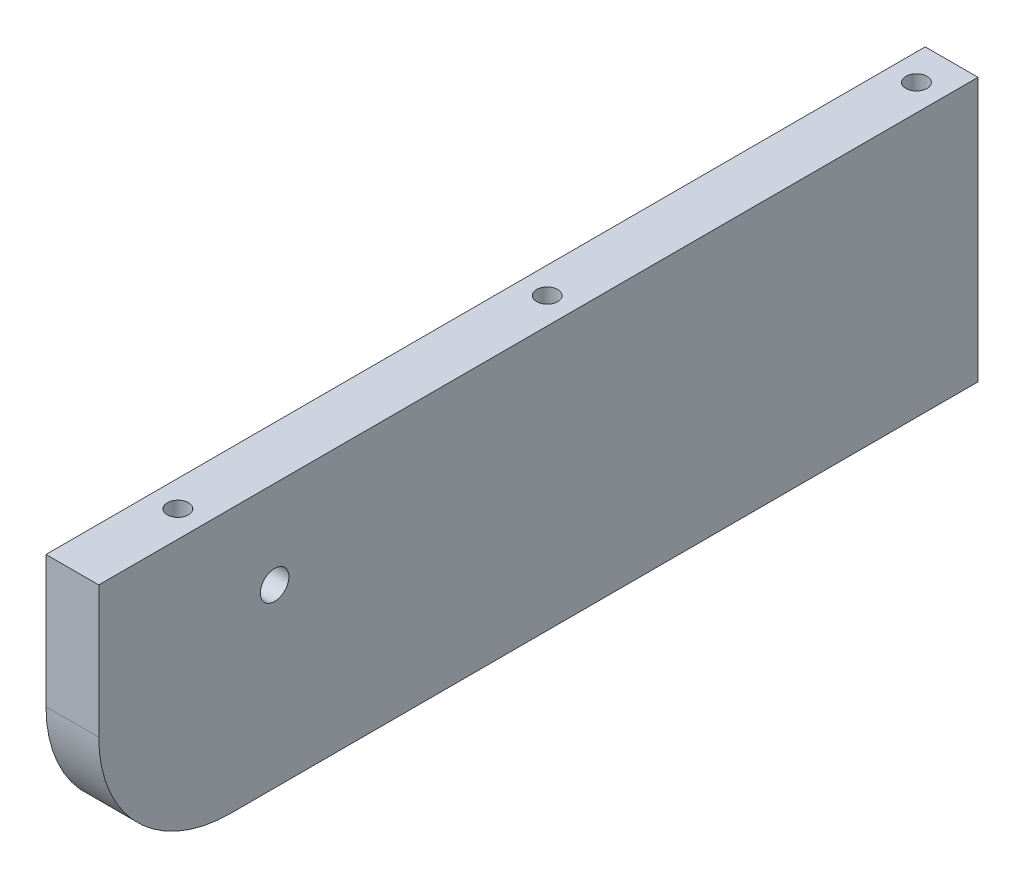
ISO-10303-21;
HEADER;
FILE_DESCRIPTION(('STEP AP214'),'2;1');
FILE_NAME('part.step','',(''),(''),'','','');
FILE_SCHEMA(('AUTOMOTIVE_DESIGN { 1 0 10303 214 1 1 1 1 }'));
ENDSEC;
DATA;
#1=APPLICATION_CONTEXT('core data for automotive mechanical design processes');
#2=APPLICATION_PROTOCOL_DEFINITION('international standard','automotive_design',2000,#1);
#3=PRODUCT_CONTEXT('',#1,'mechanical');
#4=PRODUCT('Part','Part','',(#3));
#5=PRODUCT_RELATED_PRODUCT_CATEGORY('part','',(#4));
#6=PRODUCT_DEFINITION_FORMATION('','',#4);
#7=PRODUCT_DEFINITION_CONTEXT('part definition',#1,'design');
#8=PRODUCT_DEFINITION('design','',#6,#7);
#9=PRODUCT_DEFINITION_SHAPE('','',#8);
#10=(LENGTH_UNIT() NAMED_UNIT(*) SI_UNIT(.MILLI.,.METRE.));
#11=(NAMED_UNIT(*) PLANE_ANGLE_UNIT() SI_UNIT($,.RADIAN.));
#12=(NAMED_UNIT(*) SI_UNIT($,.STERADIAN.) SOLID_ANGLE_UNIT());
#13=UNCERTAINTY_MEASURE_WITH_UNIT(LENGTH_MEASURE(1.E-05),#10,'distance_accuracy_value','');
#14=(GEOMETRIC_REPRESENTATION_CONTEXT(3) GLOBAL_UNCERTAINTY_ASSIGNED_CONTEXT((#13)) GLOBAL_UNIT_ASSIGNED_CONTEXT((#10,
#11,#12)) REPRESENTATION_CONTEXT('',''));
#15=CARTESIAN_POINT('',(0.,0.,0.));
#16=DIRECTION('',(0.,0.,1.));
#17=DIRECTION('',(1.,0.,0.));
#18=AXIS2_PLACEMENT_3D('',#15,#16,#17);
#19=CARTESIAN_POINT('',(6.,-15.,0.));
#20=DIRECTION('',(0.,1.,0.));
#21=DIRECTION('',(0.,0.,1.));
#22=AXIS2_PLACEMENT_3D('',#19,#20,#21);
#23=PLANE('',#22);
#24=DIRECTION('',(0.,0.,-1.));
#25=VECTOR('',#24,1.);
#26=CARTESIAN_POINT('',(6.,-15.,0.));
#27=LINE('',#26,#25);
#28=CARTESIAN_POINT('',(6.,-15.,35.));
#29=VERTEX_POINT('',#28);
#30=CARTESIAN_POINT('',(6.,-15.,-50.));
#31=VERTEX_POINT('',#30);
#32=EDGE_CURVE('E124',#29,#31,#27,.T.);
#33=ORIENTED_EDGE('',*,*,#32,.F.);
#34=DIRECTION('',(-1.,0.,0.));
#35=VECTOR('',#34,1.);
#36=CARTESIAN_POINT('',(0.,-15.,35.));
#37=LINE('',#36,#35);
#38=CARTESIAN_POINT('',(0.,-15.,35.));
#39=VERTEX_POINT('',#38);
#40=EDGE_CURVE('E154',#29,#39,#37,.T.);
#41=ORIENTED_EDGE('',*,*,#40,.T.);
#42=DIRECTION('',(0.,0.,-1.));
#43=VECTOR('',#42,1.);
#44=CARTESIAN_POINT('',(0.,-15.,0.));
#45=LINE('',#44,#43);
#46=CARTESIAN_POINT('',(0.,-15.,-50.));
#47=VERTEX_POINT('',#46);
#48=EDGE_CURVE('E138',#39,#47,#45,.T.);
#49=ORIENTED_EDGE('',*,*,#48,.T.);
#50=DIRECTION('',(-1.,0.,0.));
#51=VECTOR('',#50,1.);
#52=CARTESIAN_POINT('',(6.,-15.,-50.));
#53=LINE('',#52,#51);
#54=EDGE_CURVE('E151',#31,#47,#53,.T.);
#55=ORIENTED_EDGE('',*,*,#54,.F.);
#56=EDGE_LOOP('',(#33,#41,#49,#55));
#57=FACE_BOUND('',#56,.T.);
#58=ADVANCED_FACE('F46',(#57),#23,.F.);
#59=CARTESIAN_POINT('',(6.,0.,-50.));
#60=DIRECTION('',(0.,0.,1.));
#61=DIRECTION('',(1.,0.,0.));
#62=AXIS2_PLACEMENT_3D('',#59,#60,#61);
#63=PLANE('',#62);
#64=DIRECTION('',(0.,1.,0.));
#65=VECTOR('',#64,1.);
#66=CARTESIAN_POINT('',(0.,0.,-50.));
#67=LINE('',#66,#65);
#68=CARTESIAN_POINT('',(0.,15.,-50.));
#69=VERTEX_POINT('',#68);
#70=EDGE_CURVE('E140',#47,#69,#67,.T.);
#71=ORIENTED_EDGE('',*,*,#70,.T.);
#72=DIRECTION('',(-1.,0.,0.));
#73=VECTOR('',#72,1.);
#74=CARTESIAN_POINT('',(6.,15.,-50.));
#75=LINE('',#74,#73);
#76=CARTESIAN_POINT('',(6.,15.,-50.));
#77=VERTEX_POINT('',#76);
#78=EDGE_CURVE('E149',#77,#69,#75,.T.);
#79=ORIENTED_EDGE('',*,*,#78,.F.);
#80=DIRECTION('',(0.,1.,0.));
#81=VECTOR('',#80,1.);
#82=CARTESIAN_POINT('',(6.,0.,-50.));
#83=LINE('',#82,#81);
#84=EDGE_CURVE('E127',#31,#77,#83,.T.);
#85=ORIENTED_EDGE('',*,*,#84,.F.);
#86=ORIENTED_EDGE('',*,*,#54,.T.);
#87=EDGE_LOOP('',(#71,#79,#85,#86));
#88=FACE_BOUND('',#87,.T.);
#89=ADVANCED_FACE('F169',(#88),#63,.F.);
#90=CARTESIAN_POINT('',(6.,15.,0.));
#91=DIRECTION('',(0.,1.,0.));
#92=DIRECTION('',(0.,0.,1.));
#93=AXIS2_PLACEMENT_3D('',#90,#91,#92);
#94=PLANE('',#93);
#95=CARTESIAN_POINT('',(3.,15.,-45.9999999999996));
#96=DIRECTION('',(0.,1.,0.));
#97=DIRECTION('',(0.,0.,1.));
#98=AXIS2_PLACEMENT_3D('',#95,#96,#97);
#99=CIRCLE('',#98,1.2);
#100=CARTESIAN_POINT('',(3.,15.,-44.7999999999996));
#101=VERTEX_POINT('',#100);
#102=EDGE_CURVE('E50',#101,#101,#99,.T.);
#103=ORIENTED_EDGE('',*,*,#102,.F.);
#104=EDGE_LOOP('',(#103));
#105=FACE_BOUND('',#104,.T.);
#106=CARTESIAN_POINT('',(3.,15.,38.0000000000005));
#107=DIRECTION('',(0.,1.,0.));
#108=DIRECTION('',(0.,0.,1.));
#109=AXIS2_PLACEMENT_3D('',#106,#107,#108);
#110=CIRCLE('',#109,1.2);
#111=CARTESIAN_POINT('',(3.,15.,39.2000000000005));
#112=VERTEX_POINT('',#111);
#113=EDGE_CURVE('E116',#112,#112,#110,.T.);
#114=ORIENTED_EDGE('',*,*,#113,.F.);
#115=EDGE_LOOP('',(#114));
#116=FACE_BOUND('',#115,.T.);
#117=CARTESIAN_POINT('',(3.,15.,-3.99999999999956));
#118=DIRECTION('',(0.,1.,0.));
#119=DIRECTION('',(0.,0.,1.));
#120=AXIS2_PLACEMENT_3D('',#117,#118,#119);
#121=CIRCLE('',#120,1.2);
#122=CARTESIAN_POINT('',(3.,15.,-2.79999999999956));
#123=VERTEX_POINT('',#122);
#124=EDGE_CURVE('E120',#123,#123,#121,.T.);
#125=ORIENTED_EDGE('',*,*,#124,.F.);
#126=EDGE_LOOP('',(#125));
#127=FACE_BOUND('',#126,.T.);
#128=DIRECTION('',(0.,0.,-1.));
#129=VECTOR('',#128,1.);
#130=CARTESIAN_POINT('',(0.,15.,0.));
#131=LINE('',#130,#129);
#132=CARTESIAN_POINT('',(0.,15.,50.));
#133=VERTEX_POINT('',#132);
#134=EDGE_CURVE('E143',#133,#69,#131,.T.);
#135=ORIENTED_EDGE('',*,*,#134,.F.);
#136=DIRECTION('',(-1.,0.,0.));
#137=VECTOR('',#136,1.);
#138=CARTESIAN_POINT('',(6.,15.,50.));
#139=LINE('',#138,#137);
#140=CARTESIAN_POINT('',(6.,15.,50.));
#141=VERTEX_POINT('',#140);
#142=EDGE_CURVE('E134',#141,#133,#139,.T.);
#143=ORIENTED_EDGE('',*,*,#142,.F.);
#144=DIRECTION('',(0.,0.,-1.));
#145=VECTOR('',#144,1.);
#146=CARTESIAN_POINT('',(6.,15.,0.));
#147=LINE('',#146,#145);
#148=EDGE_CURVE('E129',#141,#77,#147,.T.);
#149=ORIENTED_EDGE('',*,*,#148,.T.);
#150=ORIENTED_EDGE('',*,*,#78,.T.);
#151=EDGE_LOOP('',(#135,#143,#149,#150));
#152=FACE_BOUND('',#151,.T.);
#153=ADVANCED_FACE('F165',(#105,#116,#127,#152),#94,.T.);
#154=CARTESIAN_POINT('',(6.,5.,30.));
#155=DIRECTION('',(-1.,0.,0.));
#156=DIRECTION('',(0.,0.,1.));
#157=AXIS2_PLACEMENT_3D('',#154,#155,#156);
#158=CYLINDRICAL_SURFACE('',#157,1.625);
#159=CARTESIAN_POINT('',(6.,5.,30.));
#160=DIRECTION('',(1.,0.,0.));
#161=DIRECTION('',(0.,0.,-1.));
#162=AXIS2_PLACEMENT_3D('',#159,#160,#161);
#163=CIRCLE('',#162,1.625);
#164=CARTESIAN_POINT('',(6.,5.,28.375));
#165=VERTEX_POINT('',#164);
#166=EDGE_CURVE('E121',#165,#165,#163,.T.);
#167=ORIENTED_EDGE('',*,*,#166,.T.);
#168=EDGE_LOOP('',(#167));
#169=FACE_BOUND('',#168,.T.);
#170=CARTESIAN_POINT('',(0.,5.,30.));
#171=DIRECTION('',(1.,0.,0.));
#172=DIRECTION('',(0.,0.,-1.));
#173=AXIS2_PLACEMENT_3D('',#170,#171,#172);
#174=CIRCLE('',#173,1.625);
#175=CARTESIAN_POINT('',(0.,5.,28.375));
#176=VERTEX_POINT('',#175);
#177=EDGE_CURVE('E135',#176,#176,#174,.T.);
#178=ORIENTED_EDGE('',*,*,#177,.F.);
#179=EDGE_LOOP('',(#178));
#180=FACE_BOUND('',#179,.T.);
#181=ADVANCED_FACE('F168',(#169,#180),#158,.F.);
#182=CARTESIAN_POINT('',(6.,0.,50.));
#183=DIRECTION('',(0.,0.,1.));
#184=DIRECTION('',(1.,0.,0.));
#185=AXIS2_PLACEMENT_3D('',#182,#183,#184);
#186=PLANE('',#185);
#187=DIRECTION('',(0.,1.,0.));
#188=VECTOR('',#187,1.);
#189=CARTESIAN_POINT('',(0.,0.,50.));
#190=LINE('',#189,#188);
#191=CARTESIAN_POINT('',(0.,0.,50.));
#192=VERTEX_POINT('',#191);
#193=EDGE_CURVE('E125',#192,#133,#190,.T.);
#194=ORIENTED_EDGE('',*,*,#193,.F.);
#195=DIRECTION('',(-1.,0.,0.));
#196=VECTOR('',#195,1.);
#197=CARTESIAN_POINT('',(6.,0.,50.));
#198=LINE('',#197,#196);
#199=CARTESIAN_POINT('',(6.,0.,50.));
#200=VERTEX_POINT('',#199);
#201=EDGE_CURVE('E55',#192,#200,#198,.F.);
#202=ORIENTED_EDGE('',*,*,#201,.T.);
#203=DIRECTION('',(0.,1.,0.));
#204=VECTOR('',#203,1.);
#205=CARTESIAN_POINT('',(6.,0.,50.));
#206=LINE('',#205,#204);
#207=EDGE_CURVE('E132',#200,#141,#206,.T.);
#208=ORIENTED_EDGE('',*,*,#207,.T.);
#209=ORIENTED_EDGE('',*,*,#142,.T.);
#210=EDGE_LOOP('',(#194,#202,#208,#209));
#211=FACE_BOUND('',#210,.T.);
#212=ADVANCED_FACE('F180',(#211),#186,.T.);
#213=CARTESIAN_POINT('',(6.,0.,0.));
#214=DIRECTION('',(1.,0.,0.));
#215=DIRECTION('',(0.,0.,-1.));
#216=AXIS2_PLACEMENT_3D('',#213,#214,#215);
#217=PLANE('',#216);
#218=ORIENTED_EDGE('',*,*,#166,.F.);
#219=EDGE_LOOP('',(#218));
#220=FACE_BOUND('',#219,.T.);
#221=ORIENTED_EDGE('',*,*,#207,.F.);
#222=CARTESIAN_POINT('',(6.,0.,35.));
#223=DIRECTION('',(1.,0.,0.));
#224=DIRECTION('',(0.,0.,-1.));
#225=AXIS2_PLACEMENT_3D('',#222,#223,#224);
#226=CIRCLE('',#225,15.);
#227=EDGE_CURVE('E11',#200,#29,#226,.T.);
#228=ORIENTED_EDGE('',*,*,#227,.T.);
#229=ORIENTED_EDGE('',*,*,#32,.T.);
#230=ORIENTED_EDGE('',*,*,#84,.T.);
#231=ORIENTED_EDGE('',*,*,#148,.F.);
#232=EDGE_LOOP('',(#221,#228,#229,#230,#231));
#233=FACE_BOUND('',#232,.T.);
#234=ADVANCED_FACE('F183',(#220,#233),#217,.T.);
#235=CARTESIAN_POINT('',(0.,0.,0.));
#236=DIRECTION('',(1.,0.,0.));
#237=DIRECTION('',(0.,0.,-1.));
#238=AXIS2_PLACEMENT_3D('',#235,#236,#237);
#239=PLANE('',#238);
#240=ORIENTED_EDGE('',*,*,#177,.T.);
#241=EDGE_LOOP('',(#240));
#242=FACE_BOUND('',#241,.T.);
#243=ORIENTED_EDGE('',*,*,#48,.F.);
#244=CARTESIAN_POINT('',(0.,0.,35.));
#245=DIRECTION('',(1.,0.,0.));
#246=DIRECTION('',(0.,0.,-1.));
#247=AXIS2_PLACEMENT_3D('',#244,#245,#246);
#248=CIRCLE('',#247,15.);
#249=EDGE_CURVE('E70',#39,#192,#248,.F.);
#250=ORIENTED_EDGE('',*,*,#249,.T.);
#251=ORIENTED_EDGE('',*,*,#193,.T.);
#252=ORIENTED_EDGE('',*,*,#134,.T.);
#253=ORIENTED_EDGE('',*,*,#70,.F.);
#254=EDGE_LOOP('',(#243,#250,#251,#252,#253));
#255=FACE_BOUND('',#254,.T.);
#256=ADVANCED_FACE('F179',(#242,#255),#239,.F.);
#257=CARTESIAN_POINT('',(6.,0.,35.));
#258=DIRECTION('',(1.,0.,0.));
#259=DIRECTION('',(0.,0.,-1.));
#260=AXIS2_PLACEMENT_3D('',#257,#258,#259);
#261=CYLINDRICAL_SURFACE('',#260,15.);
#262=ORIENTED_EDGE('',*,*,#227,.F.);
#263=ORIENTED_EDGE('',*,*,#201,.F.);
#264=ORIENTED_EDGE('',*,*,#249,.F.);
#265=ORIENTED_EDGE('',*,*,#40,.F.);
#266=EDGE_LOOP('',(#262,#263,#264,#265));
#267=FACE_BOUND('',#266,.T.);
#268=ADVANCED_FACE('F48',(#267),#261,.T.);
#269=CARTESIAN_POINT('',(3.,5.00000000000002,-3.99999999999956));
#270=DIRECTION('',(0.,1.,0.));
#271=DIRECTION('',(0.,0.,1.));
#272=AXIS2_PLACEMENT_3D('',#269,#270,#271);
#273=CONICAL_SURFACE('',#272,1.19999999999999,1.02974425867665);
#274=CARTESIAN_POINT('',(3.,4.27896725716695,-3.99999999999956));
#275=VERTEX_POINT('',#274);
#276=VERTEX_LOOP('',#275);
#277=FACE_BOUND('',#276,.T.);
#278=CARTESIAN_POINT('',(3.,5.00000000000002,-3.99999999999956));
#279=DIRECTION('',(0.,1.,0.));
#280=DIRECTION('',(0.,0.,1.));
#281=AXIS2_PLACEMENT_3D('',#278,#279,#280);
#282=CIRCLE('',#281,1.19999999999999);
#283=CARTESIAN_POINT('',(3.,5.00000000000002,-2.79999999999957));
#284=VERTEX_POINT('',#283);
#285=EDGE_CURVE('E117',#284,#284,#282,.T.);
#286=ORIENTED_EDGE('',*,*,#285,.T.);
#287=EDGE_LOOP('',(#286));
#288=FACE_BOUND('',#287,.T.);
#289=ADVANCED_FACE('F213',(#277,#288),#273,.F.);
#290=CARTESIAN_POINT('',(3.,25.,-3.99999999999956));
#291=DIRECTION('',(0.,1.,0.));
#292=DIRECTION('',(0.,0.,1.));
#293=AXIS2_PLACEMENT_3D('',#290,#291,#292);
#294=CYLINDRICAL_SURFACE('',#293,1.2);
#295=ORIENTED_EDGE('',*,*,#124,.T.);
#296=EDGE_LOOP('',(#295));
#297=FACE_BOUND('',#296,.T.);
#298=ORIENTED_EDGE('',*,*,#285,.F.);
#299=EDGE_LOOP('',(#298));
#300=FACE_BOUND('',#299,.T.);
#301=ADVANCED_FACE('F219',(#297,#300),#294,.F.);
#302=CARTESIAN_POINT('',(3.,5.00000000000002,38.0000000000005));
#303=DIRECTION('',(0.,1.,0.));
#304=DIRECTION('',(0.,0.,1.));
#305=AXIS2_PLACEMENT_3D('',#302,#303,#304);
#306=CONICAL_SURFACE('',#305,1.19999999999999,1.02974425867665);
#307=CARTESIAN_POINT('',(3.,4.27896725716695,38.0000000000005));
#308=VERTEX_POINT('',#307);
#309=VERTEX_LOOP('',#308);
#310=FACE_BOUND('',#309,.T.);
#311=CARTESIAN_POINT('',(3.,5.00000000000002,38.0000000000005));
#312=DIRECTION('',(0.,1.,0.));
#313=DIRECTION('',(0.,0.,1.));
#314=AXIS2_PLACEMENT_3D('',#311,#312,#313);
#315=CIRCLE('',#314,1.19999999999999);
#316=CARTESIAN_POINT('',(3.,5.00000000000002,39.2000000000005));
#317=VERTEX_POINT('',#316);
#318=EDGE_CURVE('E112',#317,#317,#315,.T.);
#319=ORIENTED_EDGE('',*,*,#318,.T.);
#320=EDGE_LOOP('',(#319));
#321=FACE_BOUND('',#320,.T.);
#322=ADVANCED_FACE('F223',(#310,#321),#306,.F.);
#323=CARTESIAN_POINT('',(3.,25.,38.0000000000005));
#324=DIRECTION('',(0.,1.,0.));
#325=DIRECTION('',(0.,0.,1.));
#326=AXIS2_PLACEMENT_3D('',#323,#324,#325);
#327=CYLINDRICAL_SURFACE('',#326,1.2);
#328=ORIENTED_EDGE('',*,*,#113,.T.);
#329=EDGE_LOOP('',(#328));
#330=FACE_BOUND('',#329,.T.);
#331=ORIENTED_EDGE('',*,*,#318,.F.);
#332=EDGE_LOOP('',(#331));
#333=FACE_BOUND('',#332,.T.);
#334=ADVANCED_FACE('F104',(#330,#333),#327,.F.);
#335=CARTESIAN_POINT('',(3.,5.00000000000002,-45.9999999999996));
#336=DIRECTION('',(0.,1.,0.));
#337=DIRECTION('',(0.,0.,1.));
#338=AXIS2_PLACEMENT_3D('',#335,#336,#337);
#339=CONICAL_SURFACE('',#338,1.19999999999999,1.02974425867665);
#340=CARTESIAN_POINT('',(3.,4.27896725716695,-45.9999999999996));
#341=VERTEX_POINT('',#340);
#342=VERTEX_LOOP('',#341);
#343=FACE_BOUND('',#342,.T.);
#344=CARTESIAN_POINT('',(3.,5.00000000000002,-45.9999999999996));
#345=DIRECTION('',(0.,1.,0.));
#346=DIRECTION('',(0.,0.,1.));
#347=AXIS2_PLACEMENT_3D('',#344,#345,#346);
#348=CIRCLE('',#347,1.19999999999999);
#349=CARTESIAN_POINT('',(3.,5.00000000000002,-44.7999999999996));
#350=VERTEX_POINT('',#349);
#351=EDGE_CURVE('E108',#350,#350,#348,.T.);
#352=ORIENTED_EDGE('',*,*,#351,.T.);
#353=EDGE_LOOP('',(#352));
#354=FACE_BOUND('',#353,.T.);
#355=ADVANCED_FACE('F100',(#343,#354),#339,.F.);
#356=CARTESIAN_POINT('',(3.,25.,-45.9999999999996));
#357=DIRECTION('',(0.,1.,0.));
#358=DIRECTION('',(0.,0.,1.));
#359=AXIS2_PLACEMENT_3D('',#356,#357,#358);
#360=CYLINDRICAL_SURFACE('',#359,1.2);
#361=ORIENTED_EDGE('',*,*,#102,.T.);
#362=EDGE_LOOP('',(#361));
#363=FACE_BOUND('',#362,.T.);
#364=ORIENTED_EDGE('',*,*,#351,.F.);
#365=EDGE_LOOP('',(#364));
#366=FACE_BOUND('',#365,.T.);
#367=ADVANCED_FACE('F103',(#363,#366),#360,.F.);
#368=CLOSED_SHELL('',(#58,#89,#153,#181,#212,#234,#256,#268,#289,#301,#322,#334,#355,#367));
#369=MANIFOLD_SOLID_BREP('B2',#368);
#370=ADVANCED_BREP_SHAPE_REPRESENTATION('',(#18,#369),#14);
#371=SHAPE_DEFINITION_REPRESENTATION(#9,#370);
ENDSEC;
END-ISO-10303-21;
